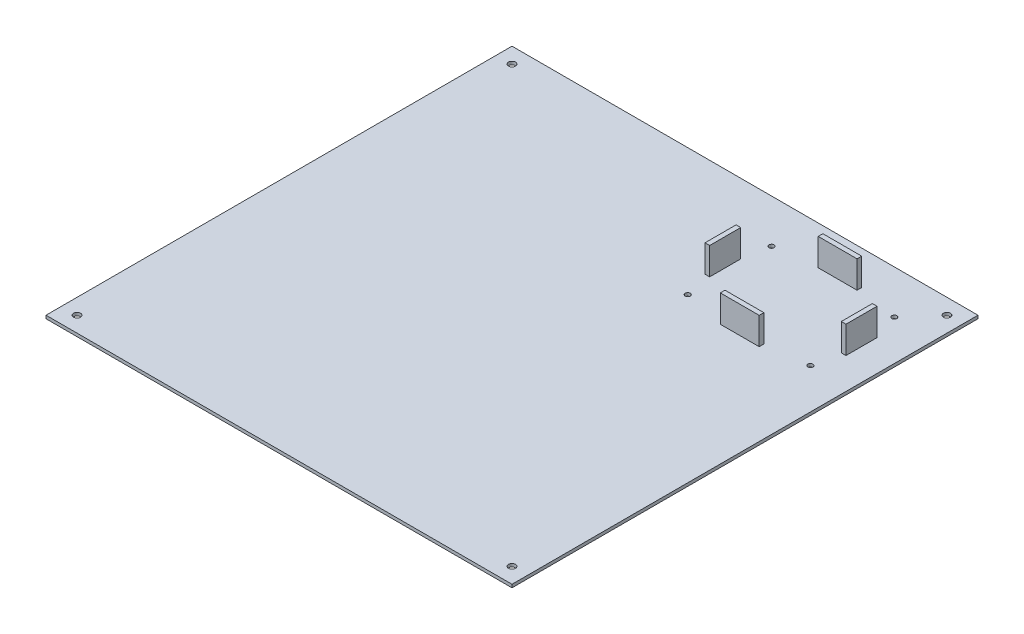
ISO-10303-21;
HEADER;
FILE_DESCRIPTION(('STEP AP214'),'2;1');
FILE_NAME('part.step','',(''),(''),'','','');
FILE_SCHEMA(('AUTOMOTIVE_DESIGN { 1 0 10303 214 1 1 1 1 }'));
ENDSEC;
DATA;
#1=APPLICATION_CONTEXT('core data for automotive mechanical design processes');
#2=APPLICATION_PROTOCOL_DEFINITION('international standard','automotive_design',2000,#1);
#3=PRODUCT_CONTEXT('',#1,'mechanical');
#4=PRODUCT('Part','Part','',(#3));
#5=PRODUCT_RELATED_PRODUCT_CATEGORY('part','',(#4));
#6=PRODUCT_DEFINITION_FORMATION('','',#4);
#7=PRODUCT_DEFINITION_CONTEXT('part definition',#1,'design');
#8=PRODUCT_DEFINITION('design','',#6,#7);
#9=PRODUCT_DEFINITION_SHAPE('','',#8);
#10=(LENGTH_UNIT() NAMED_UNIT(*) SI_UNIT(.MILLI.,.METRE.));
#11=(NAMED_UNIT(*) PLANE_ANGLE_UNIT() SI_UNIT($,.RADIAN.));
#12=(NAMED_UNIT(*) SI_UNIT($,.STERADIAN.) SOLID_ANGLE_UNIT());
#13=UNCERTAINTY_MEASURE_WITH_UNIT(LENGTH_MEASURE(1.E-05),#10,'distance_accuracy_value','');
#14=(GEOMETRIC_REPRESENTATION_CONTEXT(3) GLOBAL_UNCERTAINTY_ASSIGNED_CONTEXT((#13)) GLOBAL_UNIT_ASSIGNED_CONTEXT((#10,
#11,#12)) REPRESENTATION_CONTEXT('',''));
#15=CARTESIAN_POINT('',(0.,0.,0.));
#16=DIRECTION('',(0.,0.,1.));
#17=DIRECTION('',(1.,0.,0.));
#18=AXIS2_PLACEMENT_3D('',#15,#16,#17);
#19=CARTESIAN_POINT('',(0.,4.,0.));
#20=DIRECTION('',(0.,-1.,0.));
#21=DIRECTION('',(0.,0.,-1.));
#22=AXIS2_PLACEMENT_3D('',#19,#20,#21);
#23=PLANE('',#22);
#24=DIRECTION('',(1.,0.,0.));
#25=VECTOR('',#24,1.);
#26=CARTESIAN_POINT('',(0.,4.,-424.));
#27=LINE('',#26,#25);
#28=CARTESIAN_POINT('',(444.25,4.,-424.));
#29=VERTEX_POINT('',#28);
#30=CARTESIAN_POINT('',(494.25,4.,-424.));
#31=VERTEX_POINT('',#30);
#32=EDGE_CURVE('E226',#29,#31,#27,.T.);
#33=ORIENTED_EDGE('',*,*,#32,.F.);
#34=DIRECTION('',(0.,0.,-1.));
#35=VECTOR('',#34,1.);
#36=CARTESIAN_POINT('',(444.250000000004,4.,-4.11013815574775E-12));
#37=LINE('',#36,#35);
#38=CARTESIAN_POINT('',(444.25,4.,-430.));
#39=VERTEX_POINT('',#38);
#40=EDGE_CURVE('E192',#29,#39,#37,.T.);
#41=ORIENTED_EDGE('',*,*,#40,.T.);
#42=DIRECTION('',(1.,0.,0.));
#43=VECTOR('',#42,1.);
#44=CARTESIAN_POINT('',(0.,4.,-430.));
#45=LINE('',#44,#43);
#46=CARTESIAN_POINT('',(494.25,4.,-430.));
#47=VERTEX_POINT('',#46);
#48=EDGE_CURVE('E213',#39,#47,#45,.T.);
#49=ORIENTED_EDGE('',*,*,#48,.T.);
#50=DIRECTION('',(0.,0.,1.));
#51=VECTOR('',#50,1.);
#52=CARTESIAN_POINT('',(494.249999999996,4.,4.57273108267482E-12));
#53=LINE('',#52,#51);
#54=EDGE_CURVE('E63',#47,#31,#53,.T.);
#55=ORIENTED_EDGE('',*,*,#54,.T.);
#56=EDGE_LOOP('',(#33,#41,#49,#55));
#57=FACE_BOUND('',#56,.T.);
#58=DIRECTION('',(0.,0.,-1.));
#59=VECTOR('',#58,1.);
#60=CARTESIAN_POINT('',(560.,4.,0.));
#61=LINE('',#60,#59);
#62=CARTESIAN_POINT('',(560.,4.,-470.));
#63=VERTEX_POINT('',#62);
#64=CARTESIAN_POINT('',(560.,4.,-510.));
#65=VERTEX_POINT('',#64);
#66=EDGE_CURVE('E258',#63,#65,#61,.T.);
#67=ORIENTED_EDGE('',*,*,#66,.F.);
#68=DIRECTION('',(-1.,0.,0.));
#69=VECTOR('',#68,1.);
#70=CARTESIAN_POINT('',(0.,4.,-470.));
#71=LINE('',#70,#69);
#72=CARTESIAN_POINT('',(554.,4.,-470.));
#73=VERTEX_POINT('',#72);
#74=EDGE_CURVE('E197',#63,#73,#71,.T.);
#75=ORIENTED_EDGE('',*,*,#74,.T.);
#76=DIRECTION('',(0.,0.,-1.));
#77=VECTOR('',#76,1.);
#78=CARTESIAN_POINT('',(554.,4.,0.));
#79=LINE('',#78,#77);
#80=CARTESIAN_POINT('',(554.,4.,-510.));
#81=VERTEX_POINT('',#80);
#82=EDGE_CURVE('E243',#73,#81,#79,.T.);
#83=ORIENTED_EDGE('',*,*,#82,.T.);
#84=DIRECTION('',(1.,0.,0.));
#85=VECTOR('',#84,1.);
#86=CARTESIAN_POINT('',(0.,4.,-510.));
#87=LINE('',#86,#85);
#88=EDGE_CURVE('E71',#81,#65,#87,.T.);
#89=ORIENTED_EDGE('',*,*,#88,.T.);
#90=EDGE_LOOP('',(#67,#75,#83,#89));
#91=FACE_BOUND('',#90,.T.);
#92=DIRECTION('',(0.,0.,-1.));
#93=VECTOR('',#92,1.);
#94=CARTESIAN_POINT('',(384.5,4.,0.));
#95=LINE('',#94,#93);
#96=CARTESIAN_POINT('',(384.5,4.,-470.));
#97=VERTEX_POINT('',#96);
#98=CARTESIAN_POINT('',(384.5,4.,-510.));
#99=VERTEX_POINT('',#98);
#100=EDGE_CURVE('E299',#97,#99,#95,.T.);
#101=ORIENTED_EDGE('',*,*,#100,.F.);
#102=DIRECTION('',(-1.,0.,0.));
#103=VECTOR('',#102,1.);
#104=CARTESIAN_POINT('',(-8.69674702623025E-12,4.,-469.999999999993));
#105=LINE('',#104,#103);
#106=CARTESIAN_POINT('',(378.5,4.,-470.));
#107=VERTEX_POINT('',#106);
#108=EDGE_CURVE('E278',#97,#107,#105,.T.);
#109=ORIENTED_EDGE('',*,*,#108,.T.);
#110=DIRECTION('',(0.,0.,-1.));
#111=VECTOR('',#110,1.);
#112=CARTESIAN_POINT('',(378.5,4.,0.));
#113=LINE('',#112,#111);
#114=CARTESIAN_POINT('',(378.5,4.,-510.));
#115=VERTEX_POINT('',#114);
#116=EDGE_CURVE('E284',#107,#115,#113,.T.);
#117=ORIENTED_EDGE('',*,*,#116,.T.);
#118=DIRECTION('',(1.,0.,0.));
#119=VECTOR('',#118,1.);
#120=CARTESIAN_POINT('',(0.,4.,-510.));
#121=LINE('',#120,#119);
#122=EDGE_CURVE('E303',#115,#99,#121,.T.);
#123=ORIENTED_EDGE('',*,*,#122,.T.);
#124=EDGE_LOOP('',(#101,#109,#117,#123));
#125=FACE_BOUND('',#124,.T.);
#126=CARTESIAN_POINT('',(20.0000000000058,4.,-19.9999999999999));
#127=DIRECTION('',(0.,1.,0.));
#128=DIRECTION('',(0.,0.,1.));
#129=AXIS2_PLACEMENT_3D('',#126,#127,#128);
#130=CIRCLE('',#129,4.50000000000001);
#131=CARTESIAN_POINT('',(20.0000000000058,4.,-15.4999999999999));
#132=VERTEX_POINT('',#131);
#133=EDGE_CURVE('E400',#132,#132,#130,.T.);
#134=ORIENTED_EDGE('',*,*,#133,.F.);
#135=EDGE_LOOP('',(#134));
#136=FACE_BOUND('',#135,.T.);
#137=CARTESIAN_POINT('',(580.000000000006,4.,-19.9999999999999));
#138=DIRECTION('',(0.,1.,0.));
#139=DIRECTION('',(0.,0.,1.));
#140=AXIS2_PLACEMENT_3D('',#137,#138,#139);
#141=CIRCLE('',#140,4.50000000000002);
#142=CARTESIAN_POINT('',(580.000000000006,4.,-15.4999999999999));
#143=VERTEX_POINT('',#142);
#144=EDGE_CURVE('E408',#143,#143,#141,.T.);
#145=ORIENTED_EDGE('',*,*,#144,.F.);
#146=EDGE_LOOP('',(#145));
#147=FACE_BOUND('',#146,.T.);
#148=CARTESIAN_POINT('',(580.,4.,-580.));
#149=DIRECTION('',(0.,1.,0.));
#150=DIRECTION('',(0.,0.,1.));
#151=AXIS2_PLACEMENT_3D('',#148,#149,#150);
#152=CIRCLE('',#151,4.50000000000002);
#153=CARTESIAN_POINT('',(580.,4.,-575.5));
#154=VERTEX_POINT('',#153);
#155=EDGE_CURVE('E416',#154,#154,#152,.T.);
#156=ORIENTED_EDGE('',*,*,#155,.F.);
#157=EDGE_LOOP('',(#156));
#158=FACE_BOUND('',#157,.T.);
#159=CARTESIAN_POINT('',(20.,4.,-580.));
#160=DIRECTION('',(0.,1.,0.));
#161=DIRECTION('',(0.,0.,1.));
#162=AXIS2_PLACEMENT_3D('',#159,#160,#161);
#163=CIRCLE('',#162,4.50000000000001);
#164=CARTESIAN_POINT('',(20.,4.,-575.5));
#165=VERTEX_POINT('',#164);
#166=EDGE_CURVE('E424',#165,#165,#163,.T.);
#167=ORIENTED_EDGE('',*,*,#166,.F.);
#168=EDGE_LOOP('',(#167));
#169=FACE_BOUND('',#168,.T.);
#170=DIRECTION('',(0.,0.,1.));
#171=VECTOR('',#170,1.);
#172=CARTESIAN_POINT('',(0.,4.,0.));
#173=LINE('',#172,#171);
#174=CARTESIAN_POINT('',(0.,4.,-600.));
#175=VERTEX_POINT('',#174);
#176=CARTESIAN_POINT('',(0.,4.,0.));
#177=VERTEX_POINT('',#176);
#178=EDGE_CURVE('E432',#175,#177,#173,.T.);
#179=ORIENTED_EDGE('',*,*,#178,.T.);
#180=DIRECTION('',(1.,0.,0.));
#181=VECTOR('',#180,1.);
#182=CARTESIAN_POINT('',(0.,4.,0.));
#183=LINE('',#182,#181);
#184=CARTESIAN_POINT('',(600.,4.,0.));
#185=VERTEX_POINT('',#184);
#186=EDGE_CURVE('E436',#177,#185,#183,.T.);
#187=ORIENTED_EDGE('',*,*,#186,.T.);
#188=DIRECTION('',(0.,0.,-1.));
#189=VECTOR('',#188,1.);
#190=CARTESIAN_POINT('',(600.,4.,0.));
#191=LINE('',#190,#189);
#192=CARTESIAN_POINT('',(600.,4.,-600.));
#193=VERTEX_POINT('',#192);
#194=EDGE_CURVE('E440',#185,#193,#191,.T.);
#195=ORIENTED_EDGE('',*,*,#194,.T.);
#196=DIRECTION('',(-1.,0.,0.));
#197=VECTOR('',#196,1.);
#198=CARTESIAN_POINT('',(0.,4.,-600.));
#199=LINE('',#198,#197);
#200=EDGE_CURVE('E443',#193,#175,#199,.T.);
#201=ORIENTED_EDGE('',*,*,#200,.T.);
#202=EDGE_LOOP('',(#179,#187,#195,#201));
#203=FACE_BOUND('',#202,.T.);
#204=CARTESIAN_POINT('',(390.25,4.,-544.));
#205=DIRECTION('',(0.,1.,0.));
#206=DIRECTION('',(0.,0.,1.));
#207=AXIS2_PLACEMENT_3D('',#204,#205,#206);
#208=CIRCLE('',#207,3.24999999999989);
#209=CARTESIAN_POINT('',(390.25,4.,-540.75));
#210=VERTEX_POINT('',#209);
#211=EDGE_CURVE('E392',#210,#210,#208,.T.);
#212=ORIENTED_EDGE('',*,*,#211,.F.);
#213=EDGE_LOOP('',(#212));
#214=FACE_BOUND('',#213,.T.);
#215=CARTESIAN_POINT('',(390.25,4.,-436.));
#216=DIRECTION('',(0.,1.,0.));
#217=DIRECTION('',(0.,0.,1.));
#218=AXIS2_PLACEMENT_3D('',#215,#216,#217);
#219=CIRCLE('',#218,3.24999999999995);
#220=CARTESIAN_POINT('',(390.25,4.,-432.75));
#221=VERTEX_POINT('',#220);
#222=EDGE_CURVE('E368',#221,#221,#219,.T.);
#223=ORIENTED_EDGE('',*,*,#222,.F.);
#224=EDGE_LOOP('',(#223));
#225=FACE_BOUND('',#224,.T.);
#226=CARTESIAN_POINT('',(548.25,4.,-436.));
#227=DIRECTION('',(0.,1.,0.));
#228=DIRECTION('',(0.,0.,1.));
#229=AXIS2_PLACEMENT_3D('',#226,#227,#228);
#230=CIRCLE('',#229,3.24999999999995);
#231=CARTESIAN_POINT('',(548.25,4.,-432.75));
#232=VERTEX_POINT('',#231);
#233=EDGE_CURVE('E377',#232,#232,#230,.T.);
#234=ORIENTED_EDGE('',*,*,#233,.F.);
#235=EDGE_LOOP('',(#234));
#236=FACE_BOUND('',#235,.T.);
#237=CARTESIAN_POINT('',(548.25,4.,-544.));
#238=DIRECTION('',(0.,1.,0.));
#239=DIRECTION('',(0.,0.,1.));
#240=AXIS2_PLACEMENT_3D('',#237,#238,#239);
#241=CIRCLE('',#240,3.24999999999994);
#242=CARTESIAN_POINT('',(548.25,4.,-540.75));
#243=VERTEX_POINT('',#242);
#244=EDGE_CURVE('E385',#243,#243,#241,.T.);
#245=ORIENTED_EDGE('',*,*,#244,.F.);
#246=EDGE_LOOP('',(#245));
#247=FACE_BOUND('',#246,.T.);
#248=DIRECTION('',(1.,0.,0.));
#249=VECTOR('',#248,1.);
#250=CARTESIAN_POINT('',(0.,4.,-550.));
#251=LINE('',#250,#249);
#252=CARTESIAN_POINT('',(444.25,4.,-550.));
#253=VERTEX_POINT('',#252);
#254=CARTESIAN_POINT('',(494.25,4.,-550.));
#255=VERTEX_POINT('',#254);
#256=EDGE_CURVE('E322',#253,#255,#251,.T.);
#257=ORIENTED_EDGE('',*,*,#256,.F.);
#258=DIRECTION('',(0.,0.,1.));
#259=VECTOR('',#258,1.);
#260=CARTESIAN_POINT('',(444.25,4.,0.));
#261=LINE('',#260,#259);
#262=CARTESIAN_POINT('',(444.25,4.,-556.));
#263=VERTEX_POINT('',#262);
#264=EDGE_CURVE('E328',#263,#253,#261,.T.);
#265=ORIENTED_EDGE('',*,*,#264,.F.);
#266=DIRECTION('',(1.,0.,0.));
#267=VECTOR('',#266,1.);
#268=CARTESIAN_POINT('',(0.,4.,-556.));
#269=LINE('',#268,#267);
#270=CARTESIAN_POINT('',(494.25,4.,-556.));
#271=VERTEX_POINT('',#270);
#272=EDGE_CURVE('E346',#263,#271,#269,.T.);
#273=ORIENTED_EDGE('',*,*,#272,.T.);
#274=DIRECTION('',(0.,0.,-1.));
#275=VECTOR('',#274,1.);
#276=CARTESIAN_POINT('',(494.25000000001,4.,-9.1454621653494E-12));
#277=LINE('',#276,#275);
#278=EDGE_CURVE('E342',#255,#271,#277,.T.);
#279=ORIENTED_EDGE('',*,*,#278,.F.);
#280=EDGE_LOOP('',(#257,#265,#273,#279));
#281=FACE_BOUND('',#280,.T.);
#282=ADVANCED_FACE('F47',(#57,#91,#125,#136,#147,#158,#169,#203,#214,#225,#236,#247,#281),#23,.F.);
#283=CARTESIAN_POINT('',(0.,0.,0.));
#284=DIRECTION('',(0.,-1.,0.));
#285=DIRECTION('',(0.,0.,-1.));
#286=AXIS2_PLACEMENT_3D('',#283,#284,#285);
#287=PLANE('',#286);
#288=CARTESIAN_POINT('',(548.25,0.,-544.));
#289=DIRECTION('',(0.,-1.,0.));
#290=DIRECTION('',(0.,0.,-1.));
#291=AXIS2_PLACEMENT_3D('',#288,#289,#290);
#292=CIRCLE('',#291,3.24999999999994);
#293=CARTESIAN_POINT('',(548.25,0.,-547.25));
#294=VERTEX_POINT('',#293);
#295=EDGE_CURVE('E367',#294,#294,#292,.F.);
#296=ORIENTED_EDGE('',*,*,#295,.T.);
#297=EDGE_LOOP('',(#296));
#298=FACE_BOUND('',#297,.T.);
#299=CARTESIAN_POINT('',(548.25,0.,-436.));
#300=DIRECTION('',(0.,-1.,0.));
#301=DIRECTION('',(0.,0.,-1.));
#302=AXIS2_PLACEMENT_3D('',#299,#300,#301);
#303=CIRCLE('',#302,3.24999999999995);
#304=CARTESIAN_POINT('',(548.25,0.,-439.25));
#305=VERTEX_POINT('',#304);
#306=EDGE_CURVE('E381',#305,#305,#303,.F.);
#307=ORIENTED_EDGE('',*,*,#306,.T.);
#308=EDGE_LOOP('',(#307));
#309=FACE_BOUND('',#308,.T.);
#310=CARTESIAN_POINT('',(390.25,0.,-436.));
#311=DIRECTION('',(0.,-1.,0.));
#312=DIRECTION('',(0.,0.,-1.));
#313=AXIS2_PLACEMENT_3D('',#310,#311,#312);
#314=CIRCLE('',#313,3.24999999999995);
#315=CARTESIAN_POINT('',(390.25,0.,-439.25));
#316=VERTEX_POINT('',#315);
#317=EDGE_CURVE('E373',#316,#316,#314,.F.);
#318=ORIENTED_EDGE('',*,*,#317,.T.);
#319=EDGE_LOOP('',(#318));
#320=FACE_BOUND('',#319,.T.);
#321=CARTESIAN_POINT('',(390.25,0.,-544.));
#322=DIRECTION('',(0.,-1.,0.));
#323=DIRECTION('',(0.,0.,-1.));
#324=AXIS2_PLACEMENT_3D('',#321,#322,#323);
#325=CIRCLE('',#324,3.24999999999989);
#326=CARTESIAN_POINT('',(390.25,0.,-547.25));
#327=VERTEX_POINT('',#326);
#328=EDGE_CURVE('E372',#327,#327,#325,.F.);
#329=ORIENTED_EDGE('',*,*,#328,.T.);
#330=EDGE_LOOP('',(#329));
#331=FACE_BOUND('',#330,.T.);
#332=CARTESIAN_POINT('',(580.000000000006,0.,-19.9999999999999));
#333=DIRECTION('',(0.,1.,0.));
#334=DIRECTION('',(0.,0.,1.));
#335=AXIS2_PLACEMENT_3D('',#332,#333,#334);
#336=CIRCLE('',#335,4.50000000000002);
#337=CARTESIAN_POINT('',(580.000000000006,0.,-15.4999999999999));
#338=VERTEX_POINT('',#337);
#339=EDGE_CURVE('E404',#338,#338,#336,.T.);
#340=ORIENTED_EDGE('',*,*,#339,.T.);
#341=EDGE_LOOP('',(#340));
#342=FACE_BOUND('',#341,.T.);
#343=CARTESIAN_POINT('',(20.,0.,-580.));
#344=DIRECTION('',(0.,1.,0.));
#345=DIRECTION('',(0.,0.,1.));
#346=AXIS2_PLACEMENT_3D('',#343,#344,#345);
#347=CIRCLE('',#346,4.50000000000001);
#348=CARTESIAN_POINT('',(20.,0.,-575.5));
#349=VERTEX_POINT('',#348);
#350=EDGE_CURVE('E420',#349,#349,#347,.T.);
#351=ORIENTED_EDGE('',*,*,#350,.T.);
#352=EDGE_LOOP('',(#351));
#353=FACE_BOUND('',#352,.T.);
#354=DIRECTION('',(0.,0.,1.));
#355=VECTOR('',#354,1.);
#356=CARTESIAN_POINT('',(0.,0.,0.));
#357=LINE('',#356,#355);
#358=CARTESIAN_POINT('',(0.,0.,-600.));
#359=VERTEX_POINT('',#358);
#360=CARTESIAN_POINT('',(0.,0.,0.));
#361=VERTEX_POINT('',#360);
#362=EDGE_CURVE('E428',#359,#361,#357,.T.);
#363=ORIENTED_EDGE('',*,*,#362,.F.);
#364=DIRECTION('',(-1.,0.,0.));
#365=VECTOR('',#364,1.);
#366=CARTESIAN_POINT('',(0.,0.,-600.));
#367=LINE('',#366,#365);
#368=CARTESIAN_POINT('',(600.,0.,-600.));
#369=VERTEX_POINT('',#368);
#370=EDGE_CURVE('E437',#369,#359,#367,.T.);
#371=ORIENTED_EDGE('',*,*,#370,.F.);
#372=DIRECTION('',(0.,0.,-1.));
#373=VECTOR('',#372,1.);
#374=CARTESIAN_POINT('',(600.,0.,0.));
#375=LINE('',#374,#373);
#376=CARTESIAN_POINT('',(600.,0.,0.));
#377=VERTEX_POINT('',#376);
#378=EDGE_CURVE('E453',#377,#369,#375,.T.);
#379=ORIENTED_EDGE('',*,*,#378,.F.);
#380=DIRECTION('',(1.,0.,0.));
#381=VECTOR('',#380,1.);
#382=CARTESIAN_POINT('',(0.,0.,0.));
#383=LINE('',#382,#381);
#384=EDGE_CURVE('E450',#361,#377,#383,.T.);
#385=ORIENTED_EDGE('',*,*,#384,.F.);
#386=EDGE_LOOP('',(#363,#371,#379,#385));
#387=FACE_BOUND('',#386,.T.);
#388=CARTESIAN_POINT('',(580.,0.,-580.));
#389=DIRECTION('',(0.,1.,0.));
#390=DIRECTION('',(0.,0.,1.));
#391=AXIS2_PLACEMENT_3D('',#388,#389,#390);
#392=CIRCLE('',#391,4.50000000000002);
#393=CARTESIAN_POINT('',(580.,0.,-575.5));
#394=VERTEX_POINT('',#393);
#395=EDGE_CURVE('E412',#394,#394,#392,.T.);
#396=ORIENTED_EDGE('',*,*,#395,.T.);
#397=EDGE_LOOP('',(#396));
#398=FACE_BOUND('',#397,.T.);
#399=CARTESIAN_POINT('',(20.0000000000058,0.,-19.9999999999999));
#400=DIRECTION('',(0.,1.,0.));
#401=DIRECTION('',(0.,0.,1.));
#402=AXIS2_PLACEMENT_3D('',#399,#400,#401);
#403=CIRCLE('',#402,4.50000000000001);
#404=CARTESIAN_POINT('',(20.0000000000058,0.,-15.4999999999999));
#405=VERTEX_POINT('',#404);
#406=EDGE_CURVE('E396',#405,#405,#403,.T.);
#407=ORIENTED_EDGE('',*,*,#406,.T.);
#408=EDGE_LOOP('',(#407));
#409=FACE_BOUND('',#408,.T.);
#410=ADVANCED_FACE('F476',(#298,#309,#320,#331,#342,#353,#387,#398,#409),#287,.T.);
#411=CARTESIAN_POINT('',(0.,4.,0.));
#412=DIRECTION('',(1.,0.,0.));
#413=DIRECTION('',(0.,0.,-1.));
#414=AXIS2_PLACEMENT_3D('',#411,#412,#413);
#415=PLANE('',#414);
#416=ORIENTED_EDGE('',*,*,#362,.T.);
#417=DIRECTION('',(0.,-1.,0.));
#418=VECTOR('',#417,1.);
#419=CARTESIAN_POINT('',(0.,4.,0.));
#420=LINE('',#419,#418);
#421=EDGE_CURVE('E11',#177,#361,#420,.T.);
#422=ORIENTED_EDGE('',*,*,#421,.F.);
#423=ORIENTED_EDGE('',*,*,#178,.F.);
#424=DIRECTION('',(0.,-1.,0.));
#425=VECTOR('',#424,1.);
#426=CARTESIAN_POINT('',(0.,4.,-600.));
#427=LINE('',#426,#425);
#428=EDGE_CURVE('E446',#175,#359,#427,.T.);
#429=ORIENTED_EDGE('',*,*,#428,.T.);
#430=EDGE_LOOP('',(#416,#422,#423,#429));
#431=FACE_BOUND('',#430,.T.);
#432=ADVANCED_FACE('F49',(#431),#415,.F.);
#433=CARTESIAN_POINT('',(0.,4.,0.));
#434=DIRECTION('',(0.,0.,-1.));
#435=DIRECTION('',(-1.,0.,0.));
#436=AXIS2_PLACEMENT_3D('',#433,#434,#435);
#437=PLANE('',#436);
#438=ORIENTED_EDGE('',*,*,#384,.T.);
#439=DIRECTION('',(0.,-1.,0.));
#440=VECTOR('',#439,1.);
#441=CARTESIAN_POINT('',(600.,4.,0.));
#442=LINE('',#441,#440);
#443=EDGE_CURVE('E56',#185,#377,#442,.T.);
#444=ORIENTED_EDGE('',*,*,#443,.F.);
#445=ORIENTED_EDGE('',*,*,#186,.F.);
#446=ORIENTED_EDGE('',*,*,#421,.T.);
#447=EDGE_LOOP('',(#438,#444,#445,#446));
#448=FACE_BOUND('',#447,.T.);
#449=ADVANCED_FACE('F487',(#448),#437,.F.);
#450=CARTESIAN_POINT('',(600.,4.,0.));
#451=DIRECTION('',(-1.,0.,0.));
#452=DIRECTION('',(0.,0.,1.));
#453=AXIS2_PLACEMENT_3D('',#450,#451,#452);
#454=PLANE('',#453);
#455=ORIENTED_EDGE('',*,*,#378,.T.);
#456=DIRECTION('',(0.,-1.,0.));
#457=VECTOR('',#456,1.);
#458=CARTESIAN_POINT('',(600.,4.,-600.));
#459=LINE('',#458,#457);
#460=EDGE_CURVE('E461',#193,#369,#459,.T.);
#461=ORIENTED_EDGE('',*,*,#460,.F.);
#462=ORIENTED_EDGE('',*,*,#194,.F.);
#463=ORIENTED_EDGE('',*,*,#443,.T.);
#464=EDGE_LOOP('',(#455,#461,#462,#463));
#465=FACE_BOUND('',#464,.T.);
#466=ADVANCED_FACE('F470',(#465),#454,.F.);
#467=CARTESIAN_POINT('',(0.,4.,-600.));
#468=DIRECTION('',(0.,0.,1.));
#469=DIRECTION('',(1.,0.,0.));
#470=AXIS2_PLACEMENT_3D('',#467,#468,#469);
#471=PLANE('',#470);
#472=ORIENTED_EDGE('',*,*,#370,.T.);
#473=ORIENTED_EDGE('',*,*,#428,.F.);
#474=ORIENTED_EDGE('',*,*,#200,.F.);
#475=ORIENTED_EDGE('',*,*,#460,.T.);
#476=EDGE_LOOP('',(#472,#473,#474,#475));
#477=FACE_BOUND('',#476,.T.);
#478=ADVANCED_FACE('F480',(#477),#471,.F.);
#479=CARTESIAN_POINT('',(20.,4.,-580.));
#480=DIRECTION('',(0.,-1.,0.));
#481=DIRECTION('',(0.,0.,-1.));
#482=AXIS2_PLACEMENT_3D('',#479,#480,#481);
#483=CYLINDRICAL_SURFACE('',#482,4.50000000000001);
#484=ORIENTED_EDGE('',*,*,#166,.T.);
#485=EDGE_LOOP('',(#484));
#486=FACE_BOUND('',#485,.T.);
#487=ORIENTED_EDGE('',*,*,#350,.F.);
#488=EDGE_LOOP('',(#487));
#489=FACE_BOUND('',#488,.T.);
#490=ADVANCED_FACE('F506',(#486,#489),#483,.F.);
#491=CARTESIAN_POINT('',(580.,4.,-580.));
#492=DIRECTION('',(0.,-1.,0.));
#493=DIRECTION('',(0.,0.,-1.));
#494=AXIS2_PLACEMENT_3D('',#491,#492,#493);
#495=CYLINDRICAL_SURFACE('',#494,4.50000000000002);
#496=ORIENTED_EDGE('',*,*,#155,.T.);
#497=EDGE_LOOP('',(#496));
#498=FACE_BOUND('',#497,.T.);
#499=ORIENTED_EDGE('',*,*,#395,.F.);
#500=EDGE_LOOP('',(#499));
#501=FACE_BOUND('',#500,.T.);
#502=ADVANCED_FACE('F513',(#498,#501),#495,.F.);
#503=CARTESIAN_POINT('',(580.000000000006,4.,-19.9999999999999));
#504=DIRECTION('',(0.,-1.,0.));
#505=DIRECTION('',(0.,0.,-1.));
#506=AXIS2_PLACEMENT_3D('',#503,#504,#505);
#507=CYLINDRICAL_SURFACE('',#506,4.50000000000002);
#508=ORIENTED_EDGE('',*,*,#144,.T.);
#509=EDGE_LOOP('',(#508));
#510=FACE_BOUND('',#509,.T.);
#511=ORIENTED_EDGE('',*,*,#339,.F.);
#512=EDGE_LOOP('',(#511));
#513=FACE_BOUND('',#512,.T.);
#514=ADVANCED_FACE('F518',(#510,#513),#507,.F.);
#515=CARTESIAN_POINT('',(20.0000000000058,4.,-19.9999999999999));
#516=DIRECTION('',(0.,-1.,0.));
#517=DIRECTION('',(0.,0.,-1.));
#518=AXIS2_PLACEMENT_3D('',#515,#516,#517);
#519=CYLINDRICAL_SURFACE('',#518,4.50000000000001);
#520=ORIENTED_EDGE('',*,*,#133,.T.);
#521=EDGE_LOOP('',(#520));
#522=FACE_BOUND('',#521,.T.);
#523=ORIENTED_EDGE('',*,*,#406,.F.);
#524=EDGE_LOOP('',(#523));
#525=FACE_BOUND('',#524,.T.);
#526=ADVANCED_FACE('F528',(#522,#525),#519,.F.);
#527=CARTESIAN_POINT('',(390.25,-0.00100000000000013,-544.));
#528=DIRECTION('',(0.,1.,0.));
#529=DIRECTION('',(0.,0.,1.));
#530=AXIS2_PLACEMENT_3D('',#527,#528,#529);
#531=CYLINDRICAL_SURFACE('',#530,3.24999999999989);
#532=ORIENTED_EDGE('',*,*,#328,.F.);
#533=EDGE_LOOP('',(#532));
#534=FACE_BOUND('',#533,.T.);
#535=ORIENTED_EDGE('',*,*,#211,.T.);
#536=EDGE_LOOP('',(#535));
#537=FACE_BOUND('',#536,.T.);
#538=ADVANCED_FACE('F535',(#534,#537),#531,.F.);
#539=CARTESIAN_POINT('',(390.25,-0.00100000000000013,-436.));
#540=DIRECTION('',(0.,1.,0.));
#541=DIRECTION('',(0.,0.,1.));
#542=AXIS2_PLACEMENT_3D('',#539,#540,#541);
#543=CYLINDRICAL_SURFACE('',#542,3.24999999999995);
#544=ORIENTED_EDGE('',*,*,#317,.F.);
#545=EDGE_LOOP('',(#544));
#546=FACE_BOUND('',#545,.T.);
#547=ORIENTED_EDGE('',*,*,#222,.T.);
#548=EDGE_LOOP('',(#547));
#549=FACE_BOUND('',#548,.T.);
#550=ADVANCED_FACE('F539',(#546,#549),#543,.F.);
#551=CARTESIAN_POINT('',(548.25,-0.00100000000000013,-436.));
#552=DIRECTION('',(0.,1.,0.));
#553=DIRECTION('',(0.,0.,1.));
#554=AXIS2_PLACEMENT_3D('',#551,#552,#553);
#555=CYLINDRICAL_SURFACE('',#554,3.24999999999995);
#556=ORIENTED_EDGE('',*,*,#306,.F.);
#557=EDGE_LOOP('',(#556));
#558=FACE_BOUND('',#557,.T.);
#559=ORIENTED_EDGE('',*,*,#233,.T.);
#560=EDGE_LOOP('',(#559));
#561=FACE_BOUND('',#560,.T.);
#562=ADVANCED_FACE('F544',(#558,#561),#555,.F.);
#563=CARTESIAN_POINT('',(548.25,-0.00100000000000013,-544.));
#564=DIRECTION('',(0.,1.,0.));
#565=DIRECTION('',(0.,0.,1.));
#566=AXIS2_PLACEMENT_3D('',#563,#564,#565);
#567=CYLINDRICAL_SURFACE('',#566,3.24999999999994);
#568=ORIENTED_EDGE('',*,*,#295,.F.);
#569=EDGE_LOOP('',(#568));
#570=FACE_BOUND('',#569,.T.);
#571=ORIENTED_EDGE('',*,*,#244,.T.);
#572=EDGE_LOOP('',(#571));
#573=FACE_BOUND('',#572,.T.);
#574=ADVANCED_FACE('F541',(#570,#573),#567,.F.);
#575=CARTESIAN_POINT('',(0.,39.,-550.));
#576=DIRECTION('',(0.,0.,-1.));
#577=DIRECTION('',(-1.,0.,0.));
#578=AXIS2_PLACEMENT_3D('',#575,#576,#577);
#579=PLANE('',#578);
#580=ORIENTED_EDGE('',*,*,#256,.T.);
#581=DIRECTION('',(0.,-1.,0.));
#582=VECTOR('',#581,1.);
#583=CARTESIAN_POINT('',(494.25,39.,-550.));
#584=LINE('',#583,#582);
#585=CARTESIAN_POINT('',(494.25,39.,-550.));
#586=VERTEX_POINT('',#585);
#587=EDGE_CURVE('E363',#586,#255,#584,.T.);
#588=ORIENTED_EDGE('',*,*,#587,.F.);
#589=DIRECTION('',(1.,0.,0.));
#590=VECTOR('',#589,1.);
#591=CARTESIAN_POINT('',(0.,39.,-550.));
#592=LINE('',#591,#590);
#593=CARTESIAN_POINT('',(444.25,39.,-550.));
#594=VERTEX_POINT('',#593);
#595=EDGE_CURVE('E323',#594,#586,#592,.T.);
#596=ORIENTED_EDGE('',*,*,#595,.F.);
#597=DIRECTION('',(0.,-1.,0.));
#598=VECTOR('',#597,1.);
#599=CARTESIAN_POINT('',(444.25,39.,-550.));
#600=LINE('',#599,#598);
#601=EDGE_CURVE('E338',#594,#253,#600,.T.);
#602=ORIENTED_EDGE('',*,*,#601,.T.);
#603=EDGE_LOOP('',(#580,#588,#596,#602));
#604=FACE_BOUND('',#603,.T.);
#605=ADVANCED_FACE('F543',(#604),#579,.F.);
#606=CARTESIAN_POINT('',(494.25000000001,39.,-9.1454621653494E-12));
#607=DIRECTION('',(-1.,0.,0.));
#608=DIRECTION('',(0.,0.,1.));
#609=AXIS2_PLACEMENT_3D('',#606,#607,#608);
#610=PLANE('',#609);
#611=ORIENTED_EDGE('',*,*,#278,.T.);
#612=DIRECTION('',(0.,-1.,0.));
#613=VECTOR('',#612,1.);
#614=CARTESIAN_POINT('',(494.25,39.,-556.));
#615=LINE('',#614,#613);
#616=CARTESIAN_POINT('',(494.25,39.,-556.));
#617=VERTEX_POINT('',#616);
#618=EDGE_CURVE('E359',#617,#271,#615,.T.);
#619=ORIENTED_EDGE('',*,*,#618,.F.);
#620=DIRECTION('',(0.,0.,-1.));
#621=VECTOR('',#620,1.);
#622=CARTESIAN_POINT('',(494.25000000001,39.,-9.1454621653494E-12));
#623=LINE('',#622,#621);
#624=EDGE_CURVE('E327',#586,#617,#623,.T.);
#625=ORIENTED_EDGE('',*,*,#624,.F.);
#626=ORIENTED_EDGE('',*,*,#587,.T.);
#627=EDGE_LOOP('',(#611,#619,#625,#626));
#628=FACE_BOUND('',#627,.T.);
#629=ADVANCED_FACE('F553',(#628),#610,.F.);
#630=CARTESIAN_POINT('',(0.,39.,-556.));
#631=DIRECTION('',(0.,0.,-1.));
#632=DIRECTION('',(-1.,0.,0.));
#633=AXIS2_PLACEMENT_3D('',#630,#631,#632);
#634=PLANE('',#633);
#635=ORIENTED_EDGE('',*,*,#272,.F.);
#636=DIRECTION('',(0.,-1.,0.));
#637=VECTOR('',#636,1.);
#638=CARTESIAN_POINT('',(444.25,39.,-556.));
#639=LINE('',#638,#637);
#640=CARTESIAN_POINT('',(444.25,39.,-556.));
#641=VERTEX_POINT('',#640);
#642=EDGE_CURVE('E355',#641,#263,#639,.T.);
#643=ORIENTED_EDGE('',*,*,#642,.F.);
#644=DIRECTION('',(1.,0.,0.));
#645=VECTOR('',#644,1.);
#646=CARTESIAN_POINT('',(0.,39.,-556.));
#647=LINE('',#646,#645);
#648=EDGE_CURVE('E331',#641,#617,#647,.T.);
#649=ORIENTED_EDGE('',*,*,#648,.T.);
#650=ORIENTED_EDGE('',*,*,#618,.T.);
#651=EDGE_LOOP('',(#635,#643,#649,#650));
#652=FACE_BOUND('',#651,.T.);
#653=ADVANCED_FACE('F557',(#652),#634,.T.);
#654=CARTESIAN_POINT('',(444.25,39.,0.));
#655=DIRECTION('',(1.,0.,0.));
#656=DIRECTION('',(0.,0.,-1.));
#657=AXIS2_PLACEMENT_3D('',#654,#655,#656);
#658=PLANE('',#657);
#659=ORIENTED_EDGE('',*,*,#264,.T.);
#660=ORIENTED_EDGE('',*,*,#601,.F.);
#661=DIRECTION('',(0.,0.,1.));
#662=VECTOR('',#661,1.);
#663=CARTESIAN_POINT('',(444.25,39.,0.));
#664=LINE('',#663,#662);
#665=EDGE_CURVE('E335',#641,#594,#664,.T.);
#666=ORIENTED_EDGE('',*,*,#665,.F.);
#667=ORIENTED_EDGE('',*,*,#642,.T.);
#668=EDGE_LOOP('',(#659,#660,#666,#667));
#669=FACE_BOUND('',#668,.T.);
#670=ADVANCED_FACE('F561',(#669),#658,.F.);
#671=CARTESIAN_POINT('',(0.,39.,0.));
#672=DIRECTION('',(0.,1.,0.));
#673=DIRECTION('',(0.,0.,1.));
#674=AXIS2_PLACEMENT_3D('',#671,#672,#673);
#675=PLANE('',#674);
#676=ORIENTED_EDGE('',*,*,#595,.T.);
#677=ORIENTED_EDGE('',*,*,#624,.T.);
#678=ORIENTED_EDGE('',*,*,#648,.F.);
#679=ORIENTED_EDGE('',*,*,#665,.T.);
#680=EDGE_LOOP('',(#676,#677,#678,#679));
#681=FACE_BOUND('',#680,.T.);
#682=ADVANCED_FACE('F565',(#681),#675,.T.);
#683=CARTESIAN_POINT('',(-8.69674702623025E-12,39.,-469.999999999993));
#684=DIRECTION('',(0.,0.,1.));
#685=DIRECTION('',(1.,0.,0.));
#686=AXIS2_PLACEMENT_3D('',#683,#684,#685);
#687=PLANE('',#686);
#688=ORIENTED_EDGE('',*,*,#108,.F.);
#689=DIRECTION('',(0.,-1.,0.));
#690=VECTOR('',#689,1.);
#691=CARTESIAN_POINT('',(384.5,39.,-470.));
#692=LINE('',#691,#690);
#693=CARTESIAN_POINT('',(384.5,39.,-470.));
#694=VERTEX_POINT('',#693);
#695=EDGE_CURVE('E319',#694,#97,#692,.T.);
#696=ORIENTED_EDGE('',*,*,#695,.F.);
#697=DIRECTION('',(-1.,0.,0.));
#698=VECTOR('',#697,1.);
#699=CARTESIAN_POINT('',(-8.69674702623025E-12,39.,-469.999999999993));
#700=LINE('',#699,#698);
#701=CARTESIAN_POINT('',(378.5,39.,-470.));
#702=VERTEX_POINT('',#701);
#703=EDGE_CURVE('E279',#694,#702,#700,.T.);
#704=ORIENTED_EDGE('',*,*,#703,.T.);
#705=DIRECTION('',(0.,-1.,0.));
#706=VECTOR('',#705,1.);
#707=CARTESIAN_POINT('',(378.5,39.,-470.));
#708=LINE('',#707,#706);
#709=EDGE_CURVE('E295',#702,#107,#708,.T.);
#710=ORIENTED_EDGE('',*,*,#709,.T.);
#711=EDGE_LOOP('',(#688,#696,#704,#710));
#712=FACE_BOUND('',#711,.T.);
#713=ADVANCED_FACE('F569',(#712),#687,.T.);
#714=CARTESIAN_POINT('',(384.5,39.,0.));
#715=DIRECTION('',(-1.,0.,0.));
#716=DIRECTION('',(0.,0.,1.));
#717=AXIS2_PLACEMENT_3D('',#714,#715,#716);
#718=PLANE('',#717);
#719=ORIENTED_EDGE('',*,*,#100,.T.);
#720=DIRECTION('',(0.,-1.,0.));
#721=VECTOR('',#720,1.);
#722=CARTESIAN_POINT('',(384.5,39.,-510.));
#723=LINE('',#722,#721);
#724=CARTESIAN_POINT('',(384.5,39.,-510.));
#725=VERTEX_POINT('',#724);
#726=EDGE_CURVE('E316',#725,#99,#723,.T.);
#727=ORIENTED_EDGE('',*,*,#726,.F.);
#728=DIRECTION('',(0.,0.,-1.));
#729=VECTOR('',#728,1.);
#730=CARTESIAN_POINT('',(384.5,39.,0.));
#731=LINE('',#730,#729);
#732=EDGE_CURVE('E283',#694,#725,#731,.T.);
#733=ORIENTED_EDGE('',*,*,#732,.F.);
#734=ORIENTED_EDGE('',*,*,#695,.T.);
#735=EDGE_LOOP('',(#719,#727,#733,#734));
#736=FACE_BOUND('',#735,.T.);
#737=ADVANCED_FACE('F573',(#736),#718,.F.);
#738=CARTESIAN_POINT('',(0.,39.,-510.));
#739=DIRECTION('',(0.,0.,-1.));
#740=DIRECTION('',(-1.,0.,0.));
#741=AXIS2_PLACEMENT_3D('',#738,#739,#740);
#742=PLANE('',#741);
#743=ORIENTED_EDGE('',*,*,#122,.F.);
#744=DIRECTION('',(0.,-1.,0.));
#745=VECTOR('',#744,1.);
#746=CARTESIAN_POINT('',(378.5,39.,-510.));
#747=LINE('',#746,#745);
#748=CARTESIAN_POINT('',(378.5,39.,-510.));
#749=VERTEX_POINT('',#748);
#750=EDGE_CURVE('E312',#749,#115,#747,.T.);
#751=ORIENTED_EDGE('',*,*,#750,.F.);
#752=DIRECTION('',(1.,0.,0.));
#753=VECTOR('',#752,1.);
#754=CARTESIAN_POINT('',(0.,39.,-510.));
#755=LINE('',#754,#753);
#756=EDGE_CURVE('E287',#749,#725,#755,.T.);
#757=ORIENTED_EDGE('',*,*,#756,.T.);
#758=ORIENTED_EDGE('',*,*,#726,.T.);
#759=EDGE_LOOP('',(#743,#751,#757,#758));
#760=FACE_BOUND('',#759,.T.);
#761=ADVANCED_FACE('F577',(#760),#742,.T.);
#762=CARTESIAN_POINT('',(378.5,39.,0.));
#763=DIRECTION('',(-1.,0.,0.));
#764=DIRECTION('',(0.,0.,1.));
#765=AXIS2_PLACEMENT_3D('',#762,#763,#764);
#766=PLANE('',#765);
#767=ORIENTED_EDGE('',*,*,#116,.F.);
#768=ORIENTED_EDGE('',*,*,#709,.F.);
#769=DIRECTION('',(0.,0.,-1.));
#770=VECTOR('',#769,1.);
#771=CARTESIAN_POINT('',(378.5,39.,0.));
#772=LINE('',#771,#770);
#773=EDGE_CURVE('E291',#702,#749,#772,.T.);
#774=ORIENTED_EDGE('',*,*,#773,.T.);
#775=ORIENTED_EDGE('',*,*,#750,.T.);
#776=EDGE_LOOP('',(#767,#768,#774,#775));
#777=FACE_BOUND('',#776,.T.);
#778=ADVANCED_FACE('F581',(#777),#766,.T.);
#779=CARTESIAN_POINT('',(0.,39.,0.));
#780=DIRECTION('',(0.,1.,0.));
#781=DIRECTION('',(0.,0.,1.));
#782=AXIS2_PLACEMENT_3D('',#779,#780,#781);
#783=PLANE('',#782);
#784=ORIENTED_EDGE('',*,*,#703,.F.);
#785=ORIENTED_EDGE('',*,*,#732,.T.);
#786=ORIENTED_EDGE('',*,*,#756,.F.);
#787=ORIENTED_EDGE('',*,*,#773,.F.);
#788=EDGE_LOOP('',(#784,#785,#786,#787));
#789=FACE_BOUND('',#788,.T.);
#790=ADVANCED_FACE('F585',(#789),#783,.T.);
#791=CARTESIAN_POINT('',(0.,39.,-470.));
#792=DIRECTION('',(0.,0.,1.));
#793=DIRECTION('',(1.,0.,0.));
#794=AXIS2_PLACEMENT_3D('',#791,#792,#793);
#795=PLANE('',#794);
#796=ORIENTED_EDGE('',*,*,#74,.F.);
#797=DIRECTION('',(0.,-1.,0.));
#798=VECTOR('',#797,1.);
#799=CARTESIAN_POINT('',(560.,39.,-470.));
#800=LINE('',#799,#798);
#801=CARTESIAN_POINT('',(560.,39.,-470.));
#802=VERTEX_POINT('',#801);
#803=EDGE_CURVE('E275',#802,#63,#800,.T.);
#804=ORIENTED_EDGE('',*,*,#803,.F.);
#805=DIRECTION('',(-1.,0.,0.));
#806=VECTOR('',#805,1.);
#807=CARTESIAN_POINT('',(0.,39.,-470.));
#808=LINE('',#807,#806);
#809=CARTESIAN_POINT('',(554.,39.,-470.));
#810=VERTEX_POINT('',#809);
#811=EDGE_CURVE('E238',#802,#810,#808,.T.);
#812=ORIENTED_EDGE('',*,*,#811,.T.);
#813=DIRECTION('',(0.,-1.,0.));
#814=VECTOR('',#813,1.);
#815=CARTESIAN_POINT('',(554.,39.,-470.));
#816=LINE('',#815,#814);
#817=EDGE_CURVE('E254',#810,#73,#816,.T.);
#818=ORIENTED_EDGE('',*,*,#817,.T.);
#819=EDGE_LOOP('',(#796,#804,#812,#818));
#820=FACE_BOUND('',#819,.T.);
#821=ADVANCED_FACE('F589',(#820),#795,.T.);
#822=CARTESIAN_POINT('',(560.,39.,0.));
#823=DIRECTION('',(-1.,0.,0.));
#824=DIRECTION('',(0.,0.,1.));
#825=AXIS2_PLACEMENT_3D('',#822,#823,#824);
#826=PLANE('',#825);
#827=ORIENTED_EDGE('',*,*,#66,.T.);
#828=DIRECTION('',(0.,-1.,0.));
#829=VECTOR('',#828,1.);
#830=CARTESIAN_POINT('',(560.,39.,-510.));
#831=LINE('',#830,#829);
#832=CARTESIAN_POINT('',(560.,39.,-510.));
#833=VERTEX_POINT('',#832);
#834=EDGE_CURVE('E272',#833,#65,#831,.T.);
#835=ORIENTED_EDGE('',*,*,#834,.F.);
#836=DIRECTION('',(0.,0.,-1.));
#837=VECTOR('',#836,1.);
#838=CARTESIAN_POINT('',(560.,39.,0.));
#839=LINE('',#838,#837);
#840=EDGE_CURVE('E242',#802,#833,#839,.T.);
#841=ORIENTED_EDGE('',*,*,#840,.F.);
#842=ORIENTED_EDGE('',*,*,#803,.T.);
#843=EDGE_LOOP('',(#827,#835,#841,#842));
#844=FACE_BOUND('',#843,.T.);
#845=ADVANCED_FACE('F593',(#844),#826,.F.);
#846=CARTESIAN_POINT('',(0.,39.,-510.));
#847=DIRECTION('',(0.,0.,-1.));
#848=DIRECTION('',(-1.,0.,0.));
#849=AXIS2_PLACEMENT_3D('',#846,#847,#848);
#850=PLANE('',#849);
#851=ORIENTED_EDGE('',*,*,#88,.F.);
#852=DIRECTION('',(0.,-1.,0.));
#853=VECTOR('',#852,1.);
#854=CARTESIAN_POINT('',(554.,39.,-510.));
#855=LINE('',#854,#853);
#856=CARTESIAN_POINT('',(554.,39.,-510.));
#857=VERTEX_POINT('',#856);
#858=EDGE_CURVE('E269',#857,#81,#855,.T.);
#859=ORIENTED_EDGE('',*,*,#858,.F.);
#860=DIRECTION('',(1.,0.,0.));
#861=VECTOR('',#860,1.);
#862=CARTESIAN_POINT('',(0.,39.,-510.));
#863=LINE('',#862,#861);
#864=EDGE_CURVE('E246',#857,#833,#863,.T.);
#865=ORIENTED_EDGE('',*,*,#864,.T.);
#866=ORIENTED_EDGE('',*,*,#834,.T.);
#867=EDGE_LOOP('',(#851,#859,#865,#866));
#868=FACE_BOUND('',#867,.T.);
#869=ADVANCED_FACE('F597',(#868),#850,.T.);
#870=CARTESIAN_POINT('',(554.,39.,0.));
#871=DIRECTION('',(-1.,0.,0.));
#872=DIRECTION('',(0.,0.,1.));
#873=AXIS2_PLACEMENT_3D('',#870,#871,#872);
#874=PLANE('',#873);
#875=ORIENTED_EDGE('',*,*,#82,.F.);
#876=ORIENTED_EDGE('',*,*,#817,.F.);
#877=DIRECTION('',(0.,0.,-1.));
#878=VECTOR('',#877,1.);
#879=CARTESIAN_POINT('',(554.,39.,0.));
#880=LINE('',#879,#878);
#881=EDGE_CURVE('E250',#810,#857,#880,.T.);
#882=ORIENTED_EDGE('',*,*,#881,.T.);
#883=ORIENTED_EDGE('',*,*,#858,.T.);
#884=EDGE_LOOP('',(#875,#876,#882,#883));
#885=FACE_BOUND('',#884,.T.);
#886=ADVANCED_FACE('F601',(#885),#874,.T.);
#887=CARTESIAN_POINT('',(0.,39.,0.));
#888=DIRECTION('',(0.,1.,0.));
#889=DIRECTION('',(0.,0.,1.));
#890=AXIS2_PLACEMENT_3D('',#887,#888,#889);
#891=PLANE('',#890);
#892=ORIENTED_EDGE('',*,*,#811,.F.);
#893=ORIENTED_EDGE('',*,*,#840,.T.);
#894=ORIENTED_EDGE('',*,*,#864,.F.);
#895=ORIENTED_EDGE('',*,*,#881,.F.);
#896=EDGE_LOOP('',(#892,#893,#894,#895));
#897=FACE_BOUND('',#896,.T.);
#898=ADVANCED_FACE('F604',(#897),#891,.T.);
#899=CARTESIAN_POINT('',(444.250000000004,39.,-4.11013815574775E-12));
#900=DIRECTION('',(-1.,0.,0.));
#901=DIRECTION('',(0.,0.,1.));
#902=AXIS2_PLACEMENT_3D('',#899,#900,#901);
#903=PLANE('',#902);
#904=ORIENTED_EDGE('',*,*,#40,.F.);
#905=DIRECTION('',(0.,-1.,0.));
#906=VECTOR('',#905,1.);
#907=CARTESIAN_POINT('',(444.25,39.,-424.));
#908=LINE('',#907,#906);
#909=CARTESIAN_POINT('',(444.25,39.,-424.));
#910=VERTEX_POINT('',#909);
#911=EDGE_CURVE('E185',#910,#29,#908,.T.);
#912=ORIENTED_EDGE('',*,*,#911,.F.);
#913=DIRECTION('',(0.,0.,-1.));
#914=VECTOR('',#913,1.);
#915=CARTESIAN_POINT('',(444.250000000004,39.,-4.11013815574775E-12));
#916=LINE('',#915,#914);
#917=CARTESIAN_POINT('',(444.25,39.,-430.));
#918=VERTEX_POINT('',#917);
#919=EDGE_CURVE('E189',#910,#918,#916,.T.);
#920=ORIENTED_EDGE('',*,*,#919,.T.);
#921=DIRECTION('',(0.,-1.,0.));
#922=VECTOR('',#921,1.);
#923=CARTESIAN_POINT('',(444.25,39.,-430.));
#924=LINE('',#923,#922);
#925=EDGE_CURVE('E223',#918,#39,#924,.T.);
#926=ORIENTED_EDGE('',*,*,#925,.T.);
#927=EDGE_LOOP('',(#904,#912,#920,#926));
#928=FACE_BOUND('',#927,.T.);
#929=ADVANCED_FACE('F187',(#928),#903,.T.);
#930=CARTESIAN_POINT('',(0.,39.,-424.));
#931=DIRECTION('',(0.,0.,-1.));
#932=DIRECTION('',(-1.,0.,0.));
#933=AXIS2_PLACEMENT_3D('',#930,#931,#932);
#934=PLANE('',#933);
#935=ORIENTED_EDGE('',*,*,#32,.T.);
#936=DIRECTION('',(0.,-1.,0.));
#937=VECTOR('',#936,1.);
#938=CARTESIAN_POINT('',(494.25,39.,-424.));
#939=LINE('',#938,#937);
#940=CARTESIAN_POINT('',(494.25,39.,-424.));
#941=VERTEX_POINT('',#940);
#942=EDGE_CURVE('E198',#941,#31,#939,.T.);
#943=ORIENTED_EDGE('',*,*,#942,.F.);
#944=DIRECTION('',(1.,0.,0.));
#945=VECTOR('',#944,1.);
#946=CARTESIAN_POINT('',(0.,39.,-424.));
#947=LINE('',#946,#945);
#948=EDGE_CURVE('E201',#910,#941,#947,.T.);
#949=ORIENTED_EDGE('',*,*,#948,.F.);
#950=ORIENTED_EDGE('',*,*,#911,.T.);
#951=EDGE_LOOP('',(#935,#943,#949,#950));
#952=FACE_BOUND('',#951,.T.);
#953=ADVANCED_FACE('F202',(#952),#934,.F.);
#954=CARTESIAN_POINT('',(494.249999999996,39.,4.57273108267482E-12));
#955=DIRECTION('',(1.,0.,0.));
#956=DIRECTION('',(0.,0.,-1.));
#957=AXIS2_PLACEMENT_3D('',#954,#955,#956);
#958=PLANE('',#957);
#959=ORIENTED_EDGE('',*,*,#54,.F.);
#960=DIRECTION('',(0.,-1.,0.));
#961=VECTOR('',#960,1.);
#962=CARTESIAN_POINT('',(494.25,39.,-430.));
#963=LINE('',#962,#961);
#964=CARTESIAN_POINT('',(494.25,39.,-430.));
#965=VERTEX_POINT('',#964);
#966=EDGE_CURVE('E233',#965,#47,#963,.T.);
#967=ORIENTED_EDGE('',*,*,#966,.F.);
#968=DIRECTION('',(0.,0.,1.));
#969=VECTOR('',#968,1.);
#970=CARTESIAN_POINT('',(494.249999999996,39.,4.57273108267482E-12));
#971=LINE('',#970,#969);
#972=EDGE_CURVE('E207',#965,#941,#971,.T.);
#973=ORIENTED_EDGE('',*,*,#972,.T.);
#974=ORIENTED_EDGE('',*,*,#942,.T.);
#975=EDGE_LOOP('',(#959,#967,#973,#974));
#976=FACE_BOUND('',#975,.T.);
#977=ADVANCED_FACE('F613',(#976),#958,.T.);
#978=CARTESIAN_POINT('',(0.,39.,-430.));
#979=DIRECTION('',(0.,0.,-1.));
#980=DIRECTION('',(-1.,0.,0.));
#981=AXIS2_PLACEMENT_3D('',#978,#979,#980);
#982=PLANE('',#981);
#983=ORIENTED_EDGE('',*,*,#48,.F.);
#984=ORIENTED_EDGE('',*,*,#925,.F.);
#985=DIRECTION('',(1.,0.,0.));
#986=VECTOR('',#985,1.);
#987=CARTESIAN_POINT('',(0.,39.,-430.));
#988=LINE('',#987,#986);
#989=EDGE_CURVE('E211',#918,#965,#988,.T.);
#990=ORIENTED_EDGE('',*,*,#989,.T.);
#991=ORIENTED_EDGE('',*,*,#966,.T.);
#992=EDGE_LOOP('',(#983,#984,#990,#991));
#993=FACE_BOUND('',#992,.T.);
#994=ADVANCED_FACE('F616',(#993),#982,.T.);
#995=CARTESIAN_POINT('',(0.,39.,0.));
#996=DIRECTION('',(0.,1.,0.));
#997=DIRECTION('',(0.,0.,1.));
#998=AXIS2_PLACEMENT_3D('',#995,#996,#997);
#999=PLANE('',#998);
#1000=ORIENTED_EDGE('',*,*,#919,.F.);
#1001=ORIENTED_EDGE('',*,*,#948,.T.);
#1002=ORIENTED_EDGE('',*,*,#972,.F.);
#1003=ORIENTED_EDGE('',*,*,#989,.F.);
#1004=EDGE_LOOP('',(#1000,#1001,#1002,#1003));
#1005=FACE_BOUND('',#1004,.T.);
#1006=ADVANCED_FACE('F209',(#1005),#999,.T.);
#1007=CLOSED_SHELL('',(#282,#410,#432,#449,#466,#478,#490,#502,#514,#526,#538,#550,#562,#574,
#605,#629,#653,#670,#682,#713,#737,#761,#778,#790,#821,#845,#869,#886,#898,#929,#953,#977,#994,#1006));
#1008=MANIFOLD_SOLID_BREP('B2',#1007);
#1009=ADVANCED_BREP_SHAPE_REPRESENTATION('',(#18,#1008),#14);
#1010=SHAPE_DEFINITION_REPRESENTATION(#9,#1009);
ENDSEC;
END-ISO-10303-21;
